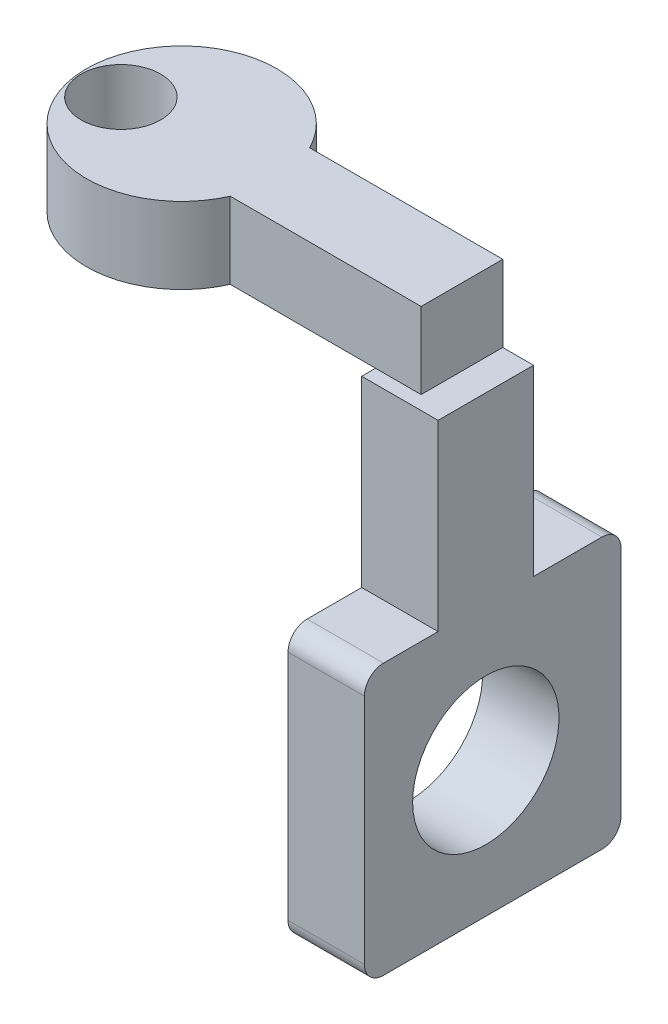
ISO-10303-21;
HEADER;
FILE_DESCRIPTION(('STEP AP214'),'2;1');
FILE_NAME('part.step','',(''),(''),'','','');
FILE_SCHEMA(('AUTOMOTIVE_DESIGN { 1 0 10303 214 1 1 1 1 }'));
ENDSEC;
DATA;
#1=APPLICATION_CONTEXT('core data for automotive mechanical design processes');
#2=APPLICATION_PROTOCOL_DEFINITION('international standard','automotive_design',2000,#1);
#3=PRODUCT_CONTEXT('',#1,'mechanical');
#4=PRODUCT('Part','Part','',(#3));
#5=PRODUCT_RELATED_PRODUCT_CATEGORY('part','',(#4));
#6=PRODUCT_DEFINITION_FORMATION('','',#4);
#7=PRODUCT_DEFINITION_CONTEXT('part definition',#1,'design');
#8=PRODUCT_DEFINITION('design','',#6,#7);
#9=PRODUCT_DEFINITION_SHAPE('','',#8);
#10=(LENGTH_UNIT() NAMED_UNIT(*) SI_UNIT(.MILLI.,.METRE.));
#11=(NAMED_UNIT(*) PLANE_ANGLE_UNIT() SI_UNIT($,.RADIAN.));
#12=(NAMED_UNIT(*) SI_UNIT($,.STERADIAN.) SOLID_ANGLE_UNIT());
#13=UNCERTAINTY_MEASURE_WITH_UNIT(LENGTH_MEASURE(1.E-05),#10,'distance_accuracy_value','');
#14=(GEOMETRIC_REPRESENTATION_CONTEXT(3) GLOBAL_UNCERTAINTY_ASSIGNED_CONTEXT((#13)) GLOBAL_UNIT_ASSIGNED_CONTEXT((#10,
#11,#12)) REPRESENTATION_CONTEXT('',''));
#15=CARTESIAN_POINT('',(0.,0.,0.));
#16=DIRECTION('',(0.,0.,1.));
#17=DIRECTION('',(1.,0.,0.));
#18=AXIS2_PLACEMENT_3D('',#15,#16,#17);
#19=CARTESIAN_POINT('',(-13.1534404276847,-33.3125,15.));
#20=DIRECTION('',(0.,0.,-1.));
#21=DIRECTION('',(-1.,0.,0.));
#22=AXIS2_PLACEMENT_3D('',#19,#20,#21);
#23=PLANE('',#22);
#24=DIRECTION('',(-1.,0.,0.));
#25=VECTOR('',#24,1.);
#26=CARTESIAN_POINT('',(-13.1534404276847,9.1875,15.));
#27=LINE('',#26,#25);
#28=CARTESIAN_POINT('',(-1.1534404276847,9.1875,15.));
#29=VERTEX_POINT('',#28);
#30=CARTESIAN_POINT('',(-13.1534404276847,9.1875,15.));
#31=VERTEX_POINT('',#30);
#32=EDGE_CURVE('E152',#29,#31,#27,.T.);
#33=ORIENTED_EDGE('',*,*,#32,.F.);
#34=DIRECTION('',(0.,1.,0.));
#35=VECTOR('',#34,1.);
#36=CARTESIAN_POINT('',(-1.15344042768471,-33.3125,15.));
#37=LINE('',#36,#35);
#38=CARTESIAN_POINT('',(-1.15344042768471,37.9375,15.));
#39=VERTEX_POINT('',#38);
#40=EDGE_CURVE('E162',#29,#39,#37,.T.);
#41=ORIENTED_EDGE('',*,*,#40,.T.);
#42=DIRECTION('',(-1.,0.,0.));
#43=VECTOR('',#42,1.);
#44=CARTESIAN_POINT('',(-13.1534404276847,37.9375,15.));
#45=LINE('',#44,#43);
#46=CARTESIAN_POINT('',(-13.1534404276847,37.9375,15.));
#47=VERTEX_POINT('',#46);
#48=EDGE_CURVE('E281',#39,#47,#45,.T.);
#49=ORIENTED_EDGE('',*,*,#48,.T.);
#50=DIRECTION('',(0.,1.,0.));
#51=VECTOR('',#50,1.);
#52=CARTESIAN_POINT('',(-13.1534404276847,-33.3125,15.));
#53=LINE('',#52,#51);
#54=EDGE_CURVE('E164',#31,#47,#53,.T.);
#55=ORIENTED_EDGE('',*,*,#54,.F.);
#56=EDGE_LOOP('',(#33,#41,#49,#55));
#57=FACE_BOUND('',#56,.T.);
#58=ADVANCED_FACE('F33',(#57),#23,.F.);
#59=CARTESIAN_POINT('',(-36.3276946614361,49.9375,0.));
#60=DIRECTION('',(0.,0.,-1.));
#61=DIRECTION('',(-1.,0.,0.));
#62=AXIS2_PLACEMENT_3D('',#59,#60,#61);
#63=PLANE('',#62);
#64=DIRECTION('',(0.,1.,0.));
#65=VECTOR('',#64,1.);
#66=CARTESIAN_POINT('',(-1.15344042768471,-33.3125,0.));
#67=LINE('',#66,#65);
#68=CARTESIAN_POINT('',(-1.1534404276847,9.1875,0.));
#69=VERTEX_POINT('',#68);
#70=CARTESIAN_POINT('',(-1.15344042768471,37.9375,0.));
#71=VERTEX_POINT('',#70);
#72=EDGE_CURVE('E171',#69,#71,#67,.T.);
#73=ORIENTED_EDGE('',*,*,#72,.F.);
#74=DIRECTION('',(1.,0.,0.));
#75=VECTOR('',#74,1.);
#76=CARTESIAN_POINT('',(-1.1534404276847,9.1875,0.));
#77=LINE('',#76,#75);
#78=CARTESIAN_POINT('',(-13.1534404276847,9.1875,0.));
#79=VERTEX_POINT('',#78);
#80=EDGE_CURVE('E165',#79,#69,#77,.T.);
#81=ORIENTED_EDGE('',*,*,#80,.F.);
#82=DIRECTION('',(0.,1.,0.));
#83=VECTOR('',#82,1.);
#84=CARTESIAN_POINT('',(-13.1534404276847,-33.3125,0.));
#85=LINE('',#84,#83);
#86=CARTESIAN_POINT('',(-13.1534404276847,37.9375,0.));
#87=VERTEX_POINT('',#86);
#88=EDGE_CURVE('E175',#79,#87,#85,.T.);
#89=ORIENTED_EDGE('',*,*,#88,.T.);
#90=DIRECTION('',(1.,0.,0.));
#91=VECTOR('',#90,1.);
#92=CARTESIAN_POINT('',(-36.3276946614361,37.9375,0.));
#93=LINE('',#92,#91);
#94=CARTESIAN_POINT('',(-36.3276946614361,37.9375,0.));
#95=VERTEX_POINT('',#94);
#96=EDGE_CURVE('E183',#95,#87,#93,.T.);
#97=ORIENTED_EDGE('',*,*,#96,.F.);
#98=DIRECTION('',(0.,-1.,0.));
#99=VECTOR('',#98,1.);
#100=CARTESIAN_POINT('',(-36.3276946614361,49.9375,0.));
#101=LINE('',#100,#99);
#102=CARTESIAN_POINT('',(-36.3276946614361,49.9375,0.));
#103=VERTEX_POINT('',#102);
#104=EDGE_CURVE('E207',#103,#95,#101,.T.);
#105=ORIENTED_EDGE('',*,*,#104,.F.);
#106=DIRECTION('',(1.,0.,0.));
#107=VECTOR('',#106,1.);
#108=CARTESIAN_POINT('',(-36.3276946614361,49.9375,0.));
#109=LINE('',#108,#107);
#110=CARTESIAN_POINT('',(-5.98649941864297,49.9375,0.));
#111=VERTEX_POINT('',#110);
#112=EDGE_CURVE('E189',#103,#111,#109,.T.);
#113=ORIENTED_EDGE('',*,*,#112,.T.);
#114=DIRECTION('',(0.,-1.,0.));
#115=VECTOR('',#114,1.);
#116=CARTESIAN_POINT('',(-5.98649941864297,49.9375,0.));
#117=LINE('',#116,#115);
#118=CARTESIAN_POINT('',(-5.98649941864297,37.9375,0.));
#119=VERTEX_POINT('',#118);
#120=EDGE_CURVE('E204',#111,#119,#117,.T.);
#121=ORIENTED_EDGE('',*,*,#120,.T.);
#122=DIRECTION('',(1.,0.,0.));
#123=VECTOR('',#122,1.);
#124=CARTESIAN_POINT('',(-1.15344042768471,37.9375,0.));
#125=LINE('',#124,#123);
#126=EDGE_CURVE('E275',#119,#71,#125,.T.);
#127=ORIENTED_EDGE('',*,*,#126,.T.);
#128=EDGE_LOOP('',(#73,#81,#89,#97,#105,#113,#121,#127));
#129=FACE_BOUND('',#128,.T.);
#130=ADVANCED_FACE('F289',(#129),#63,.T.);
#131=CARTESIAN_POINT('',(-5.98649941864297,49.9375,0.));
#132=DIRECTION('',(1.,0.,0.));
#133=DIRECTION('',(0.,0.,-1.));
#134=AXIS2_PLACEMENT_3D('',#131,#132,#133);
#135=PLANE('',#134);
#136=DIRECTION('',(0.,0.,1.));
#137=VECTOR('',#136,1.);
#138=CARTESIAN_POINT('',(-5.98649941864297,37.9375,0.));
#139=LINE('',#138,#137);
#140=CARTESIAN_POINT('',(-5.98649941864297,37.9375,12.8290034963897));
#141=VERTEX_POINT('',#140);
#142=EDGE_CURVE('E173',#119,#141,#139,.T.);
#143=ORIENTED_EDGE('',*,*,#142,.F.);
#144=ORIENTED_EDGE('',*,*,#120,.F.);
#145=DIRECTION('',(0.,0.,1.));
#146=VECTOR('',#145,1.);
#147=CARTESIAN_POINT('',(-5.98649941864297,49.9375,0.));
#148=LINE('',#147,#146);
#149=CARTESIAN_POINT('',(-5.98649941864297,49.9375,12.8290034963897));
#150=VERTEX_POINT('',#149);
#151=EDGE_CURVE('E179',#111,#150,#148,.T.);
#152=ORIENTED_EDGE('',*,*,#151,.T.);
#153=DIRECTION('',(0.,-1.,0.));
#154=VECTOR('',#153,1.);
#155=CARTESIAN_POINT('',(-5.98649941864297,49.9375,12.8290034963897));
#156=LINE('',#155,#154);
#157=EDGE_CURVE('E192',#150,#141,#156,.T.);
#158=ORIENTED_EDGE('',*,*,#157,.T.);
#159=EDGE_LOOP('',(#143,#144,#152,#158));
#160=FACE_BOUND('',#159,.T.);
#161=ADVANCED_FACE('F312',(#160),#135,.T.);
#162=CARTESIAN_POINT('',(-49.6741983122064,49.9375,6.77399737478141));
#163=DIRECTION('',(0.,-1.,0.));
#164=DIRECTION('',(0.,0.,-1.));
#165=AXIS2_PLACEMENT_3D('',#162,#163,#164);
#166=CYLINDRICAL_SURFACE('',#165,14.967170745788);
#167=CARTESIAN_POINT('',(-49.6741983122064,37.9375,6.77399737478141));
#168=DIRECTION('',(0.,-1.,0.));
#169=DIRECTION('',(0.,0.,-1.));
#170=AXIS2_PLACEMENT_3D('',#167,#168,#169);
#171=CIRCLE('',#170,14.967170745788);
#172=CARTESIAN_POINT('',(-35.986499418643,37.9375,12.8290034963897));
#173=VERTEX_POINT('',#172);
#174=EDGE_CURVE('E199',#173,#95,#171,.T.);
#175=ORIENTED_EDGE('',*,*,#174,.F.);
#176=DIRECTION('',(0.,-1.,0.));
#177=VECTOR('',#176,1.);
#178=CARTESIAN_POINT('',(-35.986499418643,49.9375,12.8290034963897));
#179=LINE('',#178,#177);
#180=CARTESIAN_POINT('',(-35.986499418643,49.9375,12.8290034963897));
#181=VERTEX_POINT('',#180);
#182=EDGE_CURVE('E209',#181,#173,#179,.T.);
#183=ORIENTED_EDGE('',*,*,#182,.F.);
#184=CARTESIAN_POINT('',(-49.6741983122064,49.9375,6.77399737478141));
#185=DIRECTION('',(0.,-1.,0.));
#186=DIRECTION('',(0.,0.,-1.));
#187=AXIS2_PLACEMENT_3D('',#184,#185,#186);
#188=CIRCLE('',#187,14.967170745788);
#189=EDGE_CURVE('E186',#181,#103,#188,.T.);
#190=ORIENTED_EDGE('',*,*,#189,.T.);
#191=ORIENTED_EDGE('',*,*,#104,.T.);
#192=EDGE_LOOP('',(#175,#183,#190,#191));
#193=FACE_BOUND('',#192,.T.);
#194=ADVANCED_FACE('F306',(#193),#166,.T.);
#195=CARTESIAN_POINT('',(-5.98649941864297,49.9375,12.8290034963897));
#196=DIRECTION('',(0.,0.,1.));
#197=DIRECTION('',(1.,0.,0.));
#198=AXIS2_PLACEMENT_3D('',#195,#196,#197);
#199=PLANE('',#198);
#200=DIRECTION('',(-1.,0.,0.));
#201=VECTOR('',#200,1.);
#202=CARTESIAN_POINT('',(-5.98649941864297,37.9375,12.8290034963897));
#203=LINE('',#202,#201);
#204=CARTESIAN_POINT('',(-13.1534404276847,37.9375,12.8290034963897));
#205=VERTEX_POINT('',#204);
#206=EDGE_CURVE('E196',#141,#205,#203,.T.);
#207=ORIENTED_EDGE('',*,*,#206,.F.);
#208=ORIENTED_EDGE('',*,*,#157,.F.);
#209=DIRECTION('',(-1.,0.,0.));
#210=VECTOR('',#209,1.);
#211=CARTESIAN_POINT('',(-5.98649941864297,49.9375,12.8290034963897));
#212=LINE('',#211,#210);
#213=EDGE_CURVE('E182',#150,#181,#212,.T.);
#214=ORIENTED_EDGE('',*,*,#213,.T.);
#215=ORIENTED_EDGE('',*,*,#182,.T.);
#216=EDGE_CURVE('E195',#205,#173,#203,.T.);
#217=ORIENTED_EDGE('',*,*,#216,.F.);
#218=EDGE_LOOP('',(#207,#208,#214,#215,#217));
#219=FACE_BOUND('',#218,.T.);
#220=ADVANCED_FACE('F302',(#219),#199,.T.);
#221=CARTESIAN_POINT('',(-49.6741983122064,49.9375,6.77399737478141));
#222=DIRECTION('',(0.,-1.,0.));
#223=DIRECTION('',(0.,0.,-1.));
#224=AXIS2_PLACEMENT_3D('',#221,#222,#223);
#225=PLANE('',#224);
#226=CARTESIAN_POINT('',(-58.0803469959912,49.9375,7.9203315090152));
#227=DIRECTION('',(0.,1.,0.));
#228=DIRECTION('',(0.,0.,1.));
#229=AXIS2_PLACEMENT_3D('',#226,#227,#228);
#230=CIRCLE('',#229,6.24999999999998);
#231=CARTESIAN_POINT('',(-58.0803469959912,49.9375,14.1703315090152));
#232=VERTEX_POINT('',#231);
#233=EDGE_CURVE('E525',#232,#232,#230,.T.);
#234=ORIENTED_EDGE('',*,*,#233,.F.);
#235=EDGE_LOOP('',(#234));
#236=FACE_BOUND('',#235,.T.);
#237=ORIENTED_EDGE('',*,*,#151,.F.);
#238=ORIENTED_EDGE('',*,*,#112,.F.);
#239=ORIENTED_EDGE('',*,*,#189,.F.);
#240=ORIENTED_EDGE('',*,*,#213,.F.);
#241=EDGE_LOOP('',(#237,#238,#239,#240));
#242=FACE_BOUND('',#241,.T.);
#243=ADVANCED_FACE('F310',(#236,#242),#225,.F.);
#244=CARTESIAN_POINT('',(-49.6741983122064,37.9375,6.77399737478141));
#245=DIRECTION('',(0.,-1.,0.));
#246=DIRECTION('',(0.,0.,-1.));
#247=AXIS2_PLACEMENT_3D('',#244,#245,#246);
#248=PLANE('',#247);
#249=CARTESIAN_POINT('',(-58.0803469959912,37.9375,7.9203315090152));
#250=DIRECTION('',(0.,-1.,0.));
#251=DIRECTION('',(0.,0.,-1.));
#252=AXIS2_PLACEMENT_3D('',#249,#250,#251);
#253=CIRCLE('',#252,6.24999999999998);
#254=CARTESIAN_POINT('',(-58.0803469959912,37.9375,1.67033150901522));
#255=VERTEX_POINT('',#254);
#256=EDGE_CURVE('E522',#255,#255,#253,.T.);
#257=ORIENTED_EDGE('',*,*,#256,.F.);
#258=EDGE_LOOP('',(#257));
#259=FACE_BOUND('',#258,.T.);
#260=DIRECTION('',(0.,0.,-1.));
#261=VECTOR('',#260,1.);
#262=CARTESIAN_POINT('',(-13.1534404276847,37.9375,0.));
#263=LINE('',#262,#261);
#264=EDGE_CURVE('E206',#205,#87,#263,.T.);
#265=ORIENTED_EDGE('',*,*,#264,.F.);
#266=ORIENTED_EDGE('',*,*,#216,.T.);
#267=ORIENTED_EDGE('',*,*,#174,.T.);
#268=ORIENTED_EDGE('',*,*,#96,.T.);
#269=EDGE_LOOP('',(#265,#266,#267,#268));
#270=FACE_BOUND('',#269,.T.);
#271=ADVANCED_FACE('F292',(#259,#270),#248,.T.);
#272=CARTESIAN_POINT('',(-1.15344042768471,-33.3125,15.));
#273=DIRECTION('',(-1.,0.,0.));
#274=DIRECTION('',(0.,0.,1.));
#275=AXIS2_PLACEMENT_3D('',#272,#273,#274);
#276=PLANE('',#275);
#277=CARTESIAN_POINT('',(-1.15344042768469,-12.0625,7.5));
#278=DIRECTION('',(-1.,0.,0.));
#279=DIRECTION('',(0.,0.,1.));
#280=AXIS2_PLACEMENT_3D('',#277,#278,#279);
#281=CIRCLE('',#280,11.5);
#282=CARTESIAN_POINT('',(-1.15344042768469,-12.0625,19.));
#283=VERTEX_POINT('',#282);
#284=EDGE_CURVE('E532',#283,#283,#281,.T.);
#285=ORIENTED_EDGE('',*,*,#284,.T.);
#286=EDGE_LOOP('',(#285));
#287=FACE_BOUND('',#286,.T.);
#288=DIRECTION('',(0.,0.,-1.));
#289=VECTOR('',#288,1.);
#290=CARTESIAN_POINT('',(-1.1534404276847,9.1875,26.5790034963897));
#291=LINE('',#290,#289);
#292=CARTESIAN_POINT('',(-1.1534404276847,9.1875,23.5790034963897));
#293=VERTEX_POINT('',#292);
#294=EDGE_CURVE('E148',#293,#29,#291,.T.);
#295=ORIENTED_EDGE('',*,*,#294,.F.);
#296=CARTESIAN_POINT('',(-1.15344042768471,6.1875,23.5790034963897));
#297=DIRECTION('',(-1.,0.,0.));
#298=DIRECTION('',(0.,0.,1.));
#299=AXIS2_PLACEMENT_3D('',#296,#297,#298);
#300=CIRCLE('',#299,3.);
#301=CARTESIAN_POINT('',(-1.15344042768469,6.1875,26.5790034963897));
#302=VERTEX_POINT('',#301);
#303=EDGE_CURVE('E232',#293,#302,#300,.F.);
#304=ORIENTED_EDGE('',*,*,#303,.T.);
#305=DIRECTION('',(0.,1.,0.));
#306=VECTOR('',#305,1.);
#307=CARTESIAN_POINT('',(-1.1534404276847,9.1875,26.5790034963897));
#308=LINE('',#307,#306);
#309=CARTESIAN_POINT('',(-1.15344042768469,-30.3125,26.5790034963897));
#310=VERTEX_POINT('',#309);
#311=EDGE_CURVE('E535',#310,#302,#308,.T.);
#312=ORIENTED_EDGE('',*,*,#311,.F.);
#313=CARTESIAN_POINT('',(-1.15344042768471,-30.3125,23.5790034963897));
#314=DIRECTION('',(-1.,0.,0.));
#315=DIRECTION('',(0.,0.,1.));
#316=AXIS2_PLACEMENT_3D('',#313,#314,#315);
#317=CIRCLE('',#316,3.);
#318=CARTESIAN_POINT('',(-1.15344042768471,-33.3125,23.5790034963897));
#319=VERTEX_POINT('',#318);
#320=EDGE_CURVE('E229',#310,#319,#317,.F.);
#321=ORIENTED_EDGE('',*,*,#320,.T.);
#322=DIRECTION('',(0.,0.,1.));
#323=VECTOR('',#322,1.);
#324=CARTESIAN_POINT('',(-1.15344042768471,-33.3125,15.));
#325=LINE('',#324,#323);
#326=CARTESIAN_POINT('',(-1.15344042768471,-33.3125,-10.75));
#327=VERTEX_POINT('',#326);
#328=EDGE_CURVE('E246',#327,#319,#325,.T.);
#329=ORIENTED_EDGE('',*,*,#328,.F.);
#330=CARTESIAN_POINT('',(-1.15344042768471,-30.3125,-10.75));
#331=DIRECTION('',(-1.,0.,0.));
#332=DIRECTION('',(0.,0.,1.));
#333=AXIS2_PLACEMENT_3D('',#330,#331,#332);
#334=CIRCLE('',#333,3.);
#335=CARTESIAN_POINT('',(-1.15344042768469,-30.3125,-13.75));
#336=VERTEX_POINT('',#335);
#337=EDGE_CURVE('E54',#327,#336,#334,.F.);
#338=ORIENTED_EDGE('',*,*,#337,.T.);
#339=DIRECTION('',(0.,-1.,0.));
#340=VECTOR('',#339,1.);
#341=CARTESIAN_POINT('',(-1.15344042768469,-33.3125,-13.75));
#342=LINE('',#341,#340);
#343=CARTESIAN_POINT('',(-1.1534404276847,6.18750000000001,-13.75));
#344=VERTEX_POINT('',#343);
#345=EDGE_CURVE('E261',#344,#336,#342,.T.);
#346=ORIENTED_EDGE('',*,*,#345,.F.);
#347=CARTESIAN_POINT('',(-1.15344042768471,6.1875,-10.75));
#348=DIRECTION('',(-1.,0.,0.));
#349=DIRECTION('',(0.,0.,1.));
#350=AXIS2_PLACEMENT_3D('',#347,#348,#349);
#351=CIRCLE('',#350,3.);
#352=CARTESIAN_POINT('',(-1.1534404276847,9.1875,-10.75));
#353=VERTEX_POINT('',#352);
#354=EDGE_CURVE('E48',#344,#353,#351,.F.);
#355=ORIENTED_EDGE('',*,*,#354,.T.);
#356=DIRECTION('',(0.,0.,1.));
#357=VECTOR('',#356,1.);
#358=CARTESIAN_POINT('',(-1.1534404276847,9.1875,-13.75));
#359=LINE('',#358,#357);
#360=EDGE_CURVE('E268',#353,#69,#359,.T.);
#361=ORIENTED_EDGE('',*,*,#360,.T.);
#362=ORIENTED_EDGE('',*,*,#72,.T.);
#363=DIRECTION('',(0.,0.,1.));
#364=VECTOR('',#363,1.);
#365=CARTESIAN_POINT('',(-1.15344042768471,37.9375,15.));
#366=LINE('',#365,#364);
#367=EDGE_CURVE('E169',#71,#39,#366,.T.);
#368=ORIENTED_EDGE('',*,*,#367,.T.);
#369=ORIENTED_EDGE('',*,*,#40,.F.);
#370=EDGE_LOOP('',(#295,#304,#312,#321,#329,#338,#346,#355,#361,#362,#368,#369));
#371=FACE_BOUND('',#370,.T.);
#372=ADVANCED_FACE('F167',(#287,#371),#276,.F.);
#373=CARTESIAN_POINT('',(-13.1534404276847,-33.3125,0.));
#374=DIRECTION('',(1.,0.,0.));
#375=DIRECTION('',(0.,0.,-1.));
#376=AXIS2_PLACEMENT_3D('',#373,#374,#375);
#377=PLANE('',#376);
#378=CARTESIAN_POINT('',(-13.1534404276847,-12.0625,7.5));
#379=DIRECTION('',(-1.,0.,0.));
#380=DIRECTION('',(0.,0.,1.));
#381=AXIS2_PLACEMENT_3D('',#378,#379,#380);
#382=CIRCLE('',#381,11.5);
#383=CARTESIAN_POINT('',(-13.1534404276847,-12.0625,19.));
#384=VERTEX_POINT('',#383);
#385=EDGE_CURVE('E527',#384,#384,#382,.T.);
#386=ORIENTED_EDGE('',*,*,#385,.F.);
#387=EDGE_LOOP('',(#386));
#388=FACE_BOUND('',#387,.T.);
#389=DIRECTION('',(0.,-1.,0.));
#390=VECTOR('',#389,1.);
#391=CARTESIAN_POINT('',(-13.1534404276847,-33.3125,26.5790034963897));
#392=LINE('',#391,#390);
#393=CARTESIAN_POINT('',(-13.1534404276847,6.1875,26.5790034963897));
#394=VERTEX_POINT('',#393);
#395=CARTESIAN_POINT('',(-13.1534404276847,-30.3125,26.5790034963897));
#396=VERTEX_POINT('',#395);
#397=EDGE_CURVE('E538',#394,#396,#392,.T.);
#398=ORIENTED_EDGE('',*,*,#397,.F.);
#399=CARTESIAN_POINT('',(-13.1534404276847,6.1875,23.5790034963897));
#400=DIRECTION('',(1.,0.,0.));
#401=DIRECTION('',(0.,0.,-1.));
#402=AXIS2_PLACEMENT_3D('',#399,#400,#401);
#403=CIRCLE('',#402,3.);
#404=CARTESIAN_POINT('',(-13.1534404276847,9.1875,23.5790034963897));
#405=VERTEX_POINT('',#404);
#406=EDGE_CURVE('E225',#394,#405,#403,.F.);
#407=ORIENTED_EDGE('',*,*,#406,.T.);
#408=DIRECTION('',(0.,0.,-1.));
#409=VECTOR('',#408,1.);
#410=CARTESIAN_POINT('',(-13.1534404276847,9.1875,26.5790034963897));
#411=LINE('',#410,#409);
#412=EDGE_CURVE('E158',#405,#31,#411,.T.);
#413=ORIENTED_EDGE('',*,*,#412,.T.);
#414=ORIENTED_EDGE('',*,*,#54,.T.);
#415=EDGE_CURVE('E252',#47,#205,#263,.T.);
#416=ORIENTED_EDGE('',*,*,#415,.T.);
#417=ORIENTED_EDGE('',*,*,#264,.T.);
#418=ORIENTED_EDGE('',*,*,#88,.F.);
#419=DIRECTION('',(0.,0.,1.));
#420=VECTOR('',#419,1.);
#421=CARTESIAN_POINT('',(-13.1534404276847,9.1875,-13.75));
#422=LINE('',#421,#420);
#423=CARTESIAN_POINT('',(-13.1534404276847,9.1875,-10.75));
#424=VERTEX_POINT('',#423);
#425=EDGE_CURVE('E274',#424,#79,#422,.T.);
#426=ORIENTED_EDGE('',*,*,#425,.F.);
#427=CARTESIAN_POINT('',(-13.1534404276847,6.1875,-10.75));
#428=DIRECTION('',(1.,0.,0.));
#429=DIRECTION('',(0.,0.,-1.));
#430=AXIS2_PLACEMENT_3D('',#427,#428,#429);
#431=CIRCLE('',#430,3.);
#432=CARTESIAN_POINT('',(-13.1534404276847,6.1875,-13.75));
#433=VERTEX_POINT('',#432);
#434=EDGE_CURVE('E223',#424,#433,#431,.F.);
#435=ORIENTED_EDGE('',*,*,#434,.T.);
#436=DIRECTION('',(0.,1.,0.));
#437=VECTOR('',#436,1.);
#438=CARTESIAN_POINT('',(-13.1534404276847,9.1875,-13.75));
#439=LINE('',#438,#437);
#440=CARTESIAN_POINT('',(-13.1534404276847,-30.3125,-13.75));
#441=VERTEX_POINT('',#440);
#442=EDGE_CURVE('E259',#441,#433,#439,.T.);
#443=ORIENTED_EDGE('',*,*,#442,.F.);
#444=CARTESIAN_POINT('',(-13.1534404276847,-30.3125,-10.75));
#445=DIRECTION('',(1.,0.,0.));
#446=DIRECTION('',(0.,0.,-1.));
#447=AXIS2_PLACEMENT_3D('',#444,#445,#446);
#448=CIRCLE('',#447,3.);
#449=CARTESIAN_POINT('',(-13.1534404276847,-33.3125,-10.75));
#450=VERTEX_POINT('',#449);
#451=EDGE_CURVE('E219',#441,#450,#448,.F.);
#452=ORIENTED_EDGE('',*,*,#451,.T.);
#453=DIRECTION('',(0.,0.,-1.));
#454=VECTOR('',#453,1.);
#455=CARTESIAN_POINT('',(-13.1534404276847,-33.3125,0.));
#456=LINE('',#455,#454);
#457=CARTESIAN_POINT('',(-13.1534404276847,-33.3125,23.5790034963897));
#458=VERTEX_POINT('',#457);
#459=EDGE_CURVE('E249',#458,#450,#456,.T.);
#460=ORIENTED_EDGE('',*,*,#459,.F.);
#461=CARTESIAN_POINT('',(-13.1534404276847,-30.3125,23.5790034963897));
#462=DIRECTION('',(1.,0.,0.));
#463=DIRECTION('',(0.,0.,-1.));
#464=AXIS2_PLACEMENT_3D('',#461,#462,#463);
#465=CIRCLE('',#464,3.);
#466=EDGE_CURVE('E221',#458,#396,#465,.F.);
#467=ORIENTED_EDGE('',*,*,#466,.T.);
#468=EDGE_LOOP('',(#398,#407,#413,#414,#416,#417,#418,#426,#435,#443,#452,#460,#467));
#469=FACE_BOUND('',#468,.T.);
#470=ADVANCED_FACE('F264',(#388,#469),#377,.F.);
#471=CARTESIAN_POINT('',(0.,-33.3125,0.));
#472=DIRECTION('',(0.,1.,0.));
#473=DIRECTION('',(0.,0.,1.));
#474=AXIS2_PLACEMENT_3D('',#471,#472,#473);
#475=PLANE('',#474);
#476=ORIENTED_EDGE('',*,*,#328,.T.);
#477=DIRECTION('',(1.,0.,0.));
#478=VECTOR('',#477,1.);
#479=CARTESIAN_POINT('',(0.,-33.3125,23.5790034963897));
#480=LINE('',#479,#478);
#481=EDGE_CURVE('E11',#319,#458,#480,.F.);
#482=ORIENTED_EDGE('',*,*,#481,.T.);
#483=ORIENTED_EDGE('',*,*,#459,.T.);
#484=DIRECTION('',(-1.,0.,0.));
#485=VECTOR('',#484,1.);
#486=CARTESIAN_POINT('',(0.,-33.3125,-10.75));
#487=LINE('',#486,#485);
#488=EDGE_CURVE('E41',#450,#327,#487,.F.);
#489=ORIENTED_EDGE('',*,*,#488,.T.);
#490=EDGE_LOOP('',(#476,#482,#483,#489));
#491=FACE_BOUND('',#490,.T.);
#492=ADVANCED_FACE('F245',(#491),#475,.F.);
#493=CARTESIAN_POINT('',(0.,37.9375,0.));
#494=DIRECTION('',(0.,1.,0.));
#495=DIRECTION('',(0.,0.,1.));
#496=AXIS2_PLACEMENT_3D('',#493,#494,#495);
#497=PLANE('',#496);
#498=ORIENTED_EDGE('',*,*,#126,.F.);
#499=ORIENTED_EDGE('',*,*,#142,.T.);
#500=ORIENTED_EDGE('',*,*,#206,.T.);
#501=ORIENTED_EDGE('',*,*,#415,.F.);
#502=ORIENTED_EDGE('',*,*,#48,.F.);
#503=ORIENTED_EDGE('',*,*,#367,.F.);
#504=EDGE_LOOP('',(#498,#499,#500,#501,#502,#503));
#505=FACE_BOUND('',#504,.T.);
#506=ADVANCED_FACE('F298',(#505),#497,.T.);
#507=CARTESIAN_POINT('',(-1.1534404276847,9.1875,-13.75));
#508=DIRECTION('',(0.,-1.,0.));
#509=DIRECTION('',(1.,0.,0.));
#510=AXIS2_PLACEMENT_3D('',#507,#508,#509);
#511=PLANE('',#510);
#512=ORIENTED_EDGE('',*,*,#360,.F.);
#513=DIRECTION('',(1.,0.,0.));
#514=VECTOR('',#513,1.);
#515=CARTESIAN_POINT('',(-1.1534404276847,9.1875,-10.75));
#516=LINE('',#515,#514);
#517=EDGE_CURVE('E240',#353,#424,#516,.F.);
#518=ORIENTED_EDGE('',*,*,#517,.T.);
#519=ORIENTED_EDGE('',*,*,#425,.T.);
#520=ORIENTED_EDGE('',*,*,#80,.T.);
#521=EDGE_LOOP('',(#512,#518,#519,#520));
#522=FACE_BOUND('',#521,.T.);
#523=ADVANCED_FACE('F315',(#522),#511,.F.);
#524=CARTESIAN_POINT('',(0.,0.,-13.75));
#525=DIRECTION('',(0.,0.,1.));
#526=DIRECTION('',(1.,0.,0.));
#527=AXIS2_PLACEMENT_3D('',#524,#525,#526);
#528=PLANE('',#527);
#529=ORIENTED_EDGE('',*,*,#442,.T.);
#530=DIRECTION('',(1.,0.,0.));
#531=VECTOR('',#530,1.);
#532=CARTESIAN_POINT('',(0.,6.1875,-13.75));
#533=LINE('',#532,#531);
#534=EDGE_CURVE('E237',#433,#344,#533,.T.);
#535=ORIENTED_EDGE('',*,*,#534,.T.);
#536=ORIENTED_EDGE('',*,*,#345,.T.);
#537=DIRECTION('',(-1.,0.,0.));
#538=VECTOR('',#537,1.);
#539=CARTESIAN_POINT('',(0.,-30.3125,-13.75));
#540=LINE('',#539,#538);
#541=EDGE_CURVE('E234',#336,#441,#540,.T.);
#542=ORIENTED_EDGE('',*,*,#541,.T.);
#543=EDGE_LOOP('',(#529,#535,#536,#542));
#544=FACE_BOUND('',#543,.T.);
#545=ADVANCED_FACE('F258',(#544),#528,.F.);
#546=CARTESIAN_POINT('',(-13.1534404276847,9.1875,26.5790034963897));
#547=DIRECTION('',(0.,-1.,0.));
#548=DIRECTION('',(0.,0.,-1.));
#549=AXIS2_PLACEMENT_3D('',#546,#547,#548);
#550=PLANE('',#549);
#551=ORIENTED_EDGE('',*,*,#412,.F.);
#552=DIRECTION('',(-1.,0.,0.));
#553=VECTOR('',#552,1.);
#554=CARTESIAN_POINT('',(-13.1534404276847,9.1875,23.5790034963897));
#555=LINE('',#554,#553);
#556=EDGE_CURVE('E155',#405,#293,#555,.F.);
#557=ORIENTED_EDGE('',*,*,#556,.T.);
#558=ORIENTED_EDGE('',*,*,#294,.T.);
#559=ORIENTED_EDGE('',*,*,#32,.T.);
#560=EDGE_LOOP('',(#551,#557,#558,#559));
#561=FACE_BOUND('',#560,.T.);
#562=ADVANCED_FACE('F151',(#561),#550,.F.);
#563=CARTESIAN_POINT('',(0.,0.,26.5790034963897));
#564=DIRECTION('',(0.,0.,-1.));
#565=DIRECTION('',(-1.,0.,0.));
#566=AXIS2_PLACEMENT_3D('',#563,#564,#565);
#567=PLANE('',#566);
#568=ORIENTED_EDGE('',*,*,#311,.T.);
#569=DIRECTION('',(-1.,0.,0.));
#570=VECTOR('',#569,1.);
#571=CARTESIAN_POINT('',(0.,6.1875,26.5790034963897));
#572=LINE('',#571,#570);
#573=EDGE_CURVE('E216',#302,#394,#572,.T.);
#574=ORIENTED_EDGE('',*,*,#573,.T.);
#575=ORIENTED_EDGE('',*,*,#397,.T.);
#576=DIRECTION('',(1.,0.,0.));
#577=VECTOR('',#576,1.);
#578=CARTESIAN_POINT('',(0.,-30.3125,26.5790034963897));
#579=LINE('',#578,#577);
#580=EDGE_CURVE('E213',#396,#310,#579,.T.);
#581=ORIENTED_EDGE('',*,*,#580,.T.);
#582=EDGE_LOOP('',(#568,#574,#575,#581));
#583=FACE_BOUND('',#582,.T.);
#584=ADVANCED_FACE('F414',(#583),#567,.F.);
#585=CARTESIAN_POINT('',(-13.1534404276847,-12.0625,7.5));
#586=DIRECTION('',(-1.,0.,0.));
#587=DIRECTION('',(0.,0.,1.));
#588=AXIS2_PLACEMENT_3D('',#585,#586,#587);
#589=CYLINDRICAL_SURFACE('',#588,11.5);
#590=ORIENTED_EDGE('',*,*,#284,.F.);
#591=EDGE_LOOP('',(#590));
#592=FACE_BOUND('',#591,.T.);
#593=ORIENTED_EDGE('',*,*,#385,.T.);
#594=EDGE_LOOP('',(#593));
#595=FACE_BOUND('',#594,.T.);
#596=ADVANCED_FACE('F421',(#592,#595),#589,.F.);
#597=CARTESIAN_POINT('',(-58.0803469959912,49.9375,7.9203315090152));
#598=DIRECTION('',(0.,1.,0.));
#599=DIRECTION('',(0.,0.,1.));
#600=AXIS2_PLACEMENT_3D('',#597,#598,#599);
#601=CYLINDRICAL_SURFACE('',#600,6.24999999999998);
#602=ORIENTED_EDGE('',*,*,#256,.T.);
#603=EDGE_LOOP('',(#602));
#604=FACE_BOUND('',#603,.T.);
#605=ORIENTED_EDGE('',*,*,#233,.T.);
#606=EDGE_LOOP('',(#605));
#607=FACE_BOUND('',#606,.T.);
#608=ADVANCED_FACE('F327',(#604,#607),#601,.F.);
#609=CARTESIAN_POINT('',(0.,6.1875,23.5790034963897));
#610=DIRECTION('',(-1.,0.,0.));
#611=DIRECTION('',(0.,0.,1.));
#612=AXIS2_PLACEMENT_3D('',#609,#610,#611);
#613=CYLINDRICAL_SURFACE('',#612,3.);
#614=ORIENTED_EDGE('',*,*,#303,.F.);
#615=ORIENTED_EDGE('',*,*,#556,.F.);
#616=ORIENTED_EDGE('',*,*,#406,.F.);
#617=ORIENTED_EDGE('',*,*,#573,.F.);
#618=EDGE_LOOP('',(#614,#615,#616,#617));
#619=FACE_BOUND('',#618,.T.);
#620=ADVANCED_FACE('F320',(#619),#613,.T.);
#621=CARTESIAN_POINT('',(0.,6.1875,-10.75));
#622=DIRECTION('',(1.,0.,0.));
#623=DIRECTION('',(0.,1.,0.));
#624=AXIS2_PLACEMENT_3D('',#621,#622,#623);
#625=CYLINDRICAL_SURFACE('',#624,3.);
#626=ORIENTED_EDGE('',*,*,#434,.F.);
#627=ORIENTED_EDGE('',*,*,#517,.F.);
#628=ORIENTED_EDGE('',*,*,#354,.F.);
#629=ORIENTED_EDGE('',*,*,#534,.F.);
#630=EDGE_LOOP('',(#626,#627,#628,#629));
#631=FACE_BOUND('',#630,.T.);
#632=ADVANCED_FACE('F317',(#631),#625,.T.);
#633=CARTESIAN_POINT('',(0.,-30.3125,23.5790034963897));
#634=DIRECTION('',(1.,0.,0.));
#635=DIRECTION('',(0.,0.,-1.));
#636=AXIS2_PLACEMENT_3D('',#633,#634,#635);
#637=CYLINDRICAL_SURFACE('',#636,3.);
#638=ORIENTED_EDGE('',*,*,#466,.F.);
#639=ORIENTED_EDGE('',*,*,#481,.F.);
#640=ORIENTED_EDGE('',*,*,#320,.F.);
#641=ORIENTED_EDGE('',*,*,#580,.F.);
#642=EDGE_LOOP('',(#638,#639,#640,#641));
#643=FACE_BOUND('',#642,.T.);
#644=ADVANCED_FACE('F319',(#643),#637,.T.);
#645=CARTESIAN_POINT('',(0.,-30.3125,-10.75));
#646=DIRECTION('',(-1.,0.,0.));
#647=DIRECTION('',(0.,0.,1.));
#648=AXIS2_PLACEMENT_3D('',#645,#646,#647);
#649=CYLINDRICAL_SURFACE('',#648,3.);
#650=ORIENTED_EDGE('',*,*,#337,.F.);
#651=ORIENTED_EDGE('',*,*,#488,.F.);
#652=ORIENTED_EDGE('',*,*,#451,.F.);
#653=ORIENTED_EDGE('',*,*,#541,.F.);
#654=EDGE_LOOP('',(#650,#651,#652,#653));
#655=FACE_BOUND('',#654,.T.);
#656=ADVANCED_FACE('F35',(#655),#649,.T.);
#657=CLOSED_SHELL('',(#58,#130,#161,#194,#220,#243,#271,#372,#470,#492,#506,#523,#545,#562,#584,
#596,#608,#620,#632,#644,#656));
#658=MANIFOLD_SOLID_BREP('B2',#657);
#659=ADVANCED_BREP_SHAPE_REPRESENTATION('',(#18,#658),#14);
#660=SHAPE_DEFINITION_REPRESENTATION(#9,#659);
ENDSEC;
END-ISO-10303-21;
